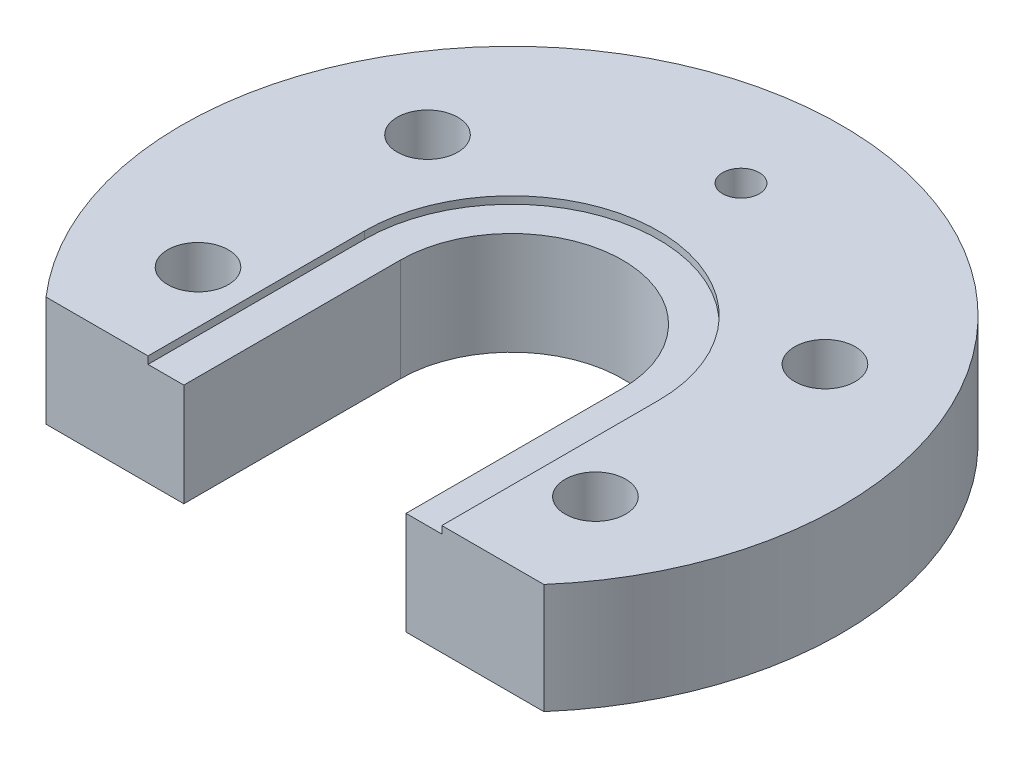
ISO-10303-21;
HEADER;
FILE_DESCRIPTION(('STEP AP214'),'2;1');
FILE_NAME('part.step','',(''),(''),'','','');
FILE_SCHEMA(('AUTOMOTIVE_DESIGN { 1 0 10303 214 1 1 1 1 }'));
ENDSEC;
DATA;
#1=APPLICATION_CONTEXT('core data for automotive mechanical design processes');
#2=APPLICATION_PROTOCOL_DEFINITION('international standard','automotive_design',2000,#1);
#3=PRODUCT_CONTEXT('',#1,'mechanical');
#4=PRODUCT('Part','Part','',(#3));
#5=PRODUCT_RELATED_PRODUCT_CATEGORY('part','',(#4));
#6=PRODUCT_DEFINITION_FORMATION('','',#4);
#7=PRODUCT_DEFINITION_CONTEXT('part definition',#1,'design');
#8=PRODUCT_DEFINITION('design','',#6,#7);
#9=PRODUCT_DEFINITION_SHAPE('','',#8);
#10=(LENGTH_UNIT() NAMED_UNIT(*) SI_UNIT(.MILLI.,.METRE.));
#11=(NAMED_UNIT(*) PLANE_ANGLE_UNIT() SI_UNIT($,.RADIAN.));
#12=(NAMED_UNIT(*) SI_UNIT($,.STERADIAN.) SOLID_ANGLE_UNIT());
#13=UNCERTAINTY_MEASURE_WITH_UNIT(LENGTH_MEASURE(1.E-05),#10,'distance_accuracy_value','');
#14=(GEOMETRIC_REPRESENTATION_CONTEXT(3) GLOBAL_UNCERTAINTY_ASSIGNED_CONTEXT((#13)) GLOBAL_UNIT_ASSIGNED_CONTEXT((#10,
#11,#12)) REPRESENTATION_CONTEXT('',''));
#15=CARTESIAN_POINT('',(0.,0.,0.));
#16=DIRECTION('',(0.,0.,1.));
#17=DIRECTION('',(1.,0.,0.));
#18=AXIS2_PLACEMENT_3D('',#15,#16,#17);
#19=CARTESIAN_POINT('',(-6.05,6.,0.));
#20=DIRECTION('',(-1.,0.,0.));
#21=DIRECTION('',(0.,0.,1.));
#22=AXIS2_PLACEMENT_3D('',#19,#20,#21);
#23=PLANE('',#22);
#24=DIRECTION('',(0.,0.,-1.));
#25=VECTOR('',#24,1.);
#26=CARTESIAN_POINT('',(-6.05,5.6,0.));
#27=LINE('',#26,#25);
#28=CARTESIAN_POINT('',(-6.05,5.6,11.79495));
#29=VERTEX_POINT('',#28);
#30=CARTESIAN_POINT('',(-6.05,5.6,0.));
#31=VERTEX_POINT('',#30);
#32=EDGE_CURVE('E179',#29,#31,#27,.T.);
#33=ORIENTED_EDGE('',*,*,#32,.F.);
#34=DIRECTION('',(0.,-1.,0.));
#35=VECTOR('',#34,1.);
#36=CARTESIAN_POINT('',(-6.05,6.,11.79495));
#37=LINE('',#36,#35);
#38=CARTESIAN_POINT('',(-6.05,0.,11.79495));
#39=VERTEX_POINT('',#38);
#40=EDGE_CURVE('E139',#29,#39,#37,.T.);
#41=ORIENTED_EDGE('',*,*,#40,.T.);
#42=DIRECTION('',(0.,0.,-1.));
#43=VECTOR('',#42,1.);
#44=CARTESIAN_POINT('',(-6.05,0.,0.));
#45=LINE('',#44,#43);
#46=CARTESIAN_POINT('',(-6.05,0.,0.));
#47=VERTEX_POINT('',#46);
#48=EDGE_CURVE('E120',#39,#47,#45,.T.);
#49=ORIENTED_EDGE('',*,*,#48,.T.);
#50=DIRECTION('',(0.,-1.,0.));
#51=VECTOR('',#50,1.);
#52=CARTESIAN_POINT('',(-6.05,6.,0.));
#53=LINE('',#52,#51);
#54=EDGE_CURVE('E137',#31,#47,#53,.T.);
#55=ORIENTED_EDGE('',*,*,#54,.F.);
#56=EDGE_LOOP('',(#33,#41,#49,#55));
#57=FACE_BOUND('',#56,.T.);
#58=ADVANCED_FACE('F45',(#57),#23,.F.);
#59=CARTESIAN_POINT('',(0.,6.,0.));
#60=DIRECTION('',(0.,-1.,0.));
#61=DIRECTION('',(0.,0.,-1.));
#62=AXIS2_PLACEMENT_3D('',#59,#60,#61);
#63=CYLINDRICAL_SURFACE('',#62,6.05);
#64=CARTESIAN_POINT('',(0.,5.6,0.));
#65=DIRECTION('',(0.,1.,0.));
#66=DIRECTION('',(0.,0.,1.));
#67=AXIS2_PLACEMENT_3D('',#64,#65,#66);
#68=CIRCLE('',#67,6.05);
#69=CARTESIAN_POINT('',(6.05,5.6,0.));
#70=VERTEX_POINT('',#69);
#71=EDGE_CURVE('E184',#31,#70,#68,.F.);
#72=ORIENTED_EDGE('',*,*,#71,.F.);
#73=ORIENTED_EDGE('',*,*,#54,.T.);
#74=CARTESIAN_POINT('',(0.,0.,0.));
#75=DIRECTION('',(0.,-1.,0.));
#76=DIRECTION('',(0.,0.,1.));
#77=AXIS2_PLACEMENT_3D('',#74,#75,#76);
#78=CIRCLE('',#77,6.05);
#79=CARTESIAN_POINT('',(6.05,0.,0.));
#80=VERTEX_POINT('',#79);
#81=EDGE_CURVE('E130',#47,#80,#78,.T.);
#82=ORIENTED_EDGE('',*,*,#81,.T.);
#83=DIRECTION('',(0.,-1.,0.));
#84=VECTOR('',#83,1.);
#85=CARTESIAN_POINT('',(6.05,6.,0.));
#86=LINE('',#85,#84);
#87=EDGE_CURVE('E135',#70,#80,#86,.T.);
#88=ORIENTED_EDGE('',*,*,#87,.F.);
#89=EDGE_LOOP('',(#72,#73,#82,#88));
#90=FACE_BOUND('',#89,.T.);
#91=ADVANCED_FACE('F251',(#90),#63,.F.);
#92=CARTESIAN_POINT('',(6.05,6.,0.));
#93=DIRECTION('',(1.,0.,0.));
#94=DIRECTION('',(0.,0.,-1.));
#95=AXIS2_PLACEMENT_3D('',#92,#93,#94);
#96=PLANE('',#95);
#97=DIRECTION('',(0.,0.,1.));
#98=VECTOR('',#97,1.);
#99=CARTESIAN_POINT('',(6.05,5.6,0.));
#100=LINE('',#99,#98);
#101=CARTESIAN_POINT('',(6.05,5.6,11.79495));
#102=VERTEX_POINT('',#101);
#103=EDGE_CURVE('E59',#70,#102,#100,.T.);
#104=ORIENTED_EDGE('',*,*,#103,.F.);
#105=ORIENTED_EDGE('',*,*,#87,.T.);
#106=DIRECTION('',(0.,0.,1.));
#107=VECTOR('',#106,1.);
#108=CARTESIAN_POINT('',(6.05,0.,0.));
#109=LINE('',#108,#107);
#110=CARTESIAN_POINT('',(6.05,0.,11.79495));
#111=VERTEX_POINT('',#110);
#112=EDGE_CURVE('E105',#80,#111,#109,.T.);
#113=ORIENTED_EDGE('',*,*,#112,.T.);
#114=DIRECTION('',(0.,-1.,0.));
#115=VECTOR('',#114,1.);
#116=CARTESIAN_POINT('',(6.05,6.,11.79495));
#117=LINE('',#116,#115);
#118=EDGE_CURVE('E99',#102,#111,#117,.T.);
#119=ORIENTED_EDGE('',*,*,#118,.F.);
#120=EDGE_LOOP('',(#104,#105,#113,#119));
#121=FACE_BOUND('',#120,.T.);
#122=ADVANCED_FACE('F254',(#121),#96,.F.);
#123=CARTESIAN_POINT('',(0.,6.,0.));
#124=DIRECTION('',(0.,1.,0.));
#125=DIRECTION('',(0.,0.,1.));
#126=AXIS2_PLACEMENT_3D('',#123,#124,#125);
#127=PLANE('',#126);
#128=DIRECTION('',(0.,0.,-1.));
#129=VECTOR('',#128,1.);
#130=CARTESIAN_POINT('',(8.,6.,11.79495));
#131=LINE('',#130,#129);
#132=CARTESIAN_POINT('',(8.,6.,11.79495));
#133=VERTEX_POINT('',#132);
#134=CARTESIAN_POINT('',(8.,6.,0.));
#135=VERTEX_POINT('',#134);
#136=EDGE_CURVE('E198',#133,#135,#131,.T.);
#137=ORIENTED_EDGE('',*,*,#136,.F.);
#138=DIRECTION('',(1.,0.,0.));
#139=VECTOR('',#138,1.);
#140=CARTESIAN_POINT('',(13.556161190396,6.,11.79495));
#141=LINE('',#140,#139);
#142=CARTESIAN_POINT('',(13.556161190396,6.,11.79495));
#143=VERTEX_POINT('',#142);
#144=EDGE_CURVE('E68',#133,#143,#141,.T.);
#145=ORIENTED_EDGE('',*,*,#144,.T.);
#146=CARTESIAN_POINT('',(0.,6.,0.));
#147=DIRECTION('',(0.,1.,0.));
#148=DIRECTION('',(0.,0.,1.));
#149=AXIS2_PLACEMENT_3D('',#146,#147,#148);
#150=CIRCLE('',#149,17.96915);
#151=CARTESIAN_POINT('',(-13.556161190396,6.,11.79495));
#152=VERTEX_POINT('',#151);
#153=EDGE_CURVE('E104',#143,#152,#150,.T.);
#154=ORIENTED_EDGE('',*,*,#153,.T.);
#155=DIRECTION('',(1.,0.,0.));
#156=VECTOR('',#155,1.);
#157=CARTESIAN_POINT('',(-6.05,6.,11.79495));
#158=LINE('',#157,#156);
#159=CARTESIAN_POINT('',(-8.,6.,11.79495));
#160=VERTEX_POINT('',#159);
#161=EDGE_CURVE('E146',#152,#160,#158,.T.);
#162=ORIENTED_EDGE('',*,*,#161,.T.);
#163=DIRECTION('',(0.,0.,1.));
#164=VECTOR('',#163,1.);
#165=CARTESIAN_POINT('',(-8.,6.,0.));
#166=LINE('',#165,#164);
#167=CARTESIAN_POINT('',(-8.,6.,0.));
#168=VERTEX_POINT('',#167);
#169=EDGE_CURVE('E202',#168,#160,#166,.T.);
#170=ORIENTED_EDGE('',*,*,#169,.F.);
#171=CARTESIAN_POINT('',(0.,6.,0.));
#172=DIRECTION('',(0.,1.,0.));
#173=DIRECTION('',(0.,0.,1.));
#174=AXIS2_PLACEMENT_3D('',#171,#172,#173);
#175=CIRCLE('',#174,8.);
#176=EDGE_CURVE('E205',#135,#168,#175,.T.);
#177=ORIENTED_EDGE('',*,*,#176,.F.);
#178=EDGE_LOOP('',(#137,#145,#154,#162,#170,#177));
#179=FACE_BOUND('',#178,.T.);
#180=CARTESIAN_POINT('',(-10.82295,6.,6.24955));
#181=DIRECTION('',(0.,1.,0.));
#182=DIRECTION('',(0.,0.,1.));
#183=AXIS2_PLACEMENT_3D('',#180,#181,#182);
#184=CIRCLE('',#183,1.65);
#185=CARTESIAN_POINT('',(-10.82295,6.,7.89955));
#186=VERTEX_POINT('',#185);
#187=EDGE_CURVE('E167',#186,#186,#184,.T.);
#188=ORIENTED_EDGE('',*,*,#187,.F.);
#189=EDGE_LOOP('',(#188));
#190=FACE_BOUND('',#189,.T.);
#191=CARTESIAN_POINT('',(10.82295,6.,-6.24955));
#192=DIRECTION('',(0.,1.,0.));
#193=DIRECTION('',(0.,0.,1.));
#194=AXIS2_PLACEMENT_3D('',#191,#192,#193);
#195=CIRCLE('',#194,1.65);
#196=CARTESIAN_POINT('',(10.82295,6.,-4.59955));
#197=VERTEX_POINT('',#196);
#198=EDGE_CURVE('E156',#197,#197,#195,.T.);
#199=ORIENTED_EDGE('',*,*,#198,.F.);
#200=EDGE_LOOP('',(#199));
#201=FACE_BOUND('',#200,.T.);
#202=CARTESIAN_POINT('',(-10.82295,6.,-6.24955));
#203=DIRECTION('',(0.,1.,0.));
#204=DIRECTION('',(0.,0.,1.));
#205=AXIS2_PLACEMENT_3D('',#202,#203,#204);
#206=CIRCLE('',#205,1.65);
#207=CARTESIAN_POINT('',(-10.82295,6.,-4.59955));
#208=VERTEX_POINT('',#207);
#209=EDGE_CURVE('E118',#208,#208,#206,.T.);
#210=ORIENTED_EDGE('',*,*,#209,.F.);
#211=EDGE_LOOP('',(#210));
#212=FACE_BOUND('',#211,.T.);
#213=CARTESIAN_POINT('',(10.82295,6.,6.24955));
#214=DIRECTION('',(0.,1.,0.));
#215=DIRECTION('',(0.,0.,1.));
#216=AXIS2_PLACEMENT_3D('',#213,#214,#215);
#217=CIRCLE('',#216,1.65);
#218=CARTESIAN_POINT('',(10.82295,6.,7.89955));
#219=VERTEX_POINT('',#218);
#220=EDGE_CURVE('E161',#219,#219,#217,.T.);
#221=ORIENTED_EDGE('',*,*,#220,.F.);
#222=EDGE_LOOP('',(#221));
#223=FACE_BOUND('',#222,.T.);
#224=CARTESIAN_POINT('',(0.,6.,-12.4985));
#225=DIRECTION('',(0.,1.,0.));
#226=DIRECTION('',(0.,0.,1.));
#227=AXIS2_PLACEMENT_3D('',#224,#225,#226);
#228=CIRCLE('',#227,1.);
#229=CARTESIAN_POINT('',(0.,6.,-11.4985));
#230=VERTEX_POINT('',#229);
#231=EDGE_CURVE('E173',#230,#230,#228,.T.);
#232=ORIENTED_EDGE('',*,*,#231,.F.);
#233=EDGE_LOOP('',(#232));
#234=FACE_BOUND('',#233,.T.);
#235=ADVANCED_FACE('F151',(#179,#190,#201,#212,#223,#234),#127,.T.);
#236=CARTESIAN_POINT('',(0.,0.,0.));
#237=DIRECTION('',(0.,1.,0.));
#238=DIRECTION('',(0.,0.,1.));
#239=AXIS2_PLACEMENT_3D('',#236,#237,#238);
#240=PLANE('',#239);
#241=CARTESIAN_POINT('',(0.,0.,0.));
#242=DIRECTION('',(0.,1.,0.));
#243=DIRECTION('',(0.,0.,1.));
#244=AXIS2_PLACEMENT_3D('',#241,#242,#243);
#245=CIRCLE('',#244,17.96915);
#246=CARTESIAN_POINT('',(13.556161190396,0.,11.79495));
#247=VERTEX_POINT('',#246);
#248=CARTESIAN_POINT('',(-13.556161190396,0.,11.79495));
#249=VERTEX_POINT('',#248);
#250=EDGE_CURVE('E110',#247,#249,#245,.T.);
#251=ORIENTED_EDGE('',*,*,#250,.F.);
#252=DIRECTION('',(1.,0.,0.));
#253=VECTOR('',#252,1.);
#254=CARTESIAN_POINT('',(13.556161190396,0.,11.79495));
#255=LINE('',#254,#253);
#256=EDGE_CURVE('E93',#111,#247,#255,.T.);
#257=ORIENTED_EDGE('',*,*,#256,.F.);
#258=ORIENTED_EDGE('',*,*,#112,.F.);
#259=ORIENTED_EDGE('',*,*,#81,.F.);
#260=ORIENTED_EDGE('',*,*,#48,.F.);
#261=DIRECTION('',(1.,0.,0.));
#262=VECTOR('',#261,1.);
#263=CARTESIAN_POINT('',(-6.05,0.,11.79495));
#264=LINE('',#263,#262);
#265=EDGE_CURVE('E116',#249,#39,#264,.T.);
#266=ORIENTED_EDGE('',*,*,#265,.F.);
#267=EDGE_LOOP('',(#251,#257,#258,#259,#260,#266));
#268=FACE_BOUND('',#267,.T.);
#269=CARTESIAN_POINT('',(-10.82295,0.,-6.24955));
#270=DIRECTION('',(0.,1.,0.));
#271=DIRECTION('',(0.,0.,1.));
#272=AXIS2_PLACEMENT_3D('',#269,#270,#271);
#273=CIRCLE('',#272,1.65);
#274=CARTESIAN_POINT('',(-10.82295,0.,-4.59955));
#275=VERTEX_POINT('',#274);
#276=EDGE_CURVE('E123',#275,#275,#273,.T.);
#277=ORIENTED_EDGE('',*,*,#276,.T.);
#278=EDGE_LOOP('',(#277));
#279=FACE_BOUND('',#278,.T.);
#280=CARTESIAN_POINT('',(10.82295,0.,-6.24955));
#281=DIRECTION('',(0.,1.,0.));
#282=DIRECTION('',(0.,0.,1.));
#283=AXIS2_PLACEMENT_3D('',#280,#281,#282);
#284=CIRCLE('',#283,1.65);
#285=CARTESIAN_POINT('',(10.82295,0.,-4.59955));
#286=VERTEX_POINT('',#285);
#287=EDGE_CURVE('E158',#286,#286,#284,.T.);
#288=ORIENTED_EDGE('',*,*,#287,.T.);
#289=EDGE_LOOP('',(#288));
#290=FACE_BOUND('',#289,.T.);
#291=CARTESIAN_POINT('',(10.82295,0.,6.24955));
#292=DIRECTION('',(0.,1.,0.));
#293=DIRECTION('',(0.,0.,1.));
#294=AXIS2_PLACEMENT_3D('',#291,#292,#293);
#295=CIRCLE('',#294,1.65);
#296=CARTESIAN_POINT('',(10.82295,0.,7.89955));
#297=VERTEX_POINT('',#296);
#298=EDGE_CURVE('E164',#297,#297,#295,.T.);
#299=ORIENTED_EDGE('',*,*,#298,.T.);
#300=EDGE_LOOP('',(#299));
#301=FACE_BOUND('',#300,.T.);
#302=CARTESIAN_POINT('',(-10.82295,0.,6.24955));
#303=DIRECTION('',(0.,1.,0.));
#304=DIRECTION('',(0.,0.,1.));
#305=AXIS2_PLACEMENT_3D('',#302,#303,#304);
#306=CIRCLE('',#305,1.65);
#307=CARTESIAN_POINT('',(-10.82295,0.,7.89955));
#308=VERTEX_POINT('',#307);
#309=EDGE_CURVE('E170',#308,#308,#306,.T.);
#310=ORIENTED_EDGE('',*,*,#309,.T.);
#311=EDGE_LOOP('',(#310));
#312=FACE_BOUND('',#311,.T.);
#313=CARTESIAN_POINT('',(0.,0.,-12.4985));
#314=DIRECTION('',(0.,1.,0.));
#315=DIRECTION('',(0.,0.,1.));
#316=AXIS2_PLACEMENT_3D('',#313,#314,#315);
#317=CIRCLE('',#316,1.);
#318=CARTESIAN_POINT('',(0.,0.,-11.4985));
#319=VERTEX_POINT('',#318);
#320=EDGE_CURVE('E176',#319,#319,#317,.T.);
#321=ORIENTED_EDGE('',*,*,#320,.T.);
#322=EDGE_LOOP('',(#321));
#323=FACE_BOUND('',#322,.T.);
#324=ADVANCED_FACE('F112',(#268,#279,#290,#301,#312,#323),#240,.F.);
#325=CARTESIAN_POINT('',(0.,6.,0.));
#326=DIRECTION('',(0.,-1.,0.));
#327=DIRECTION('',(0.,0.,-1.));
#328=AXIS2_PLACEMENT_3D('',#325,#326,#327);
#329=CYLINDRICAL_SURFACE('',#328,17.96915);
#330=ORIENTED_EDGE('',*,*,#250,.T.);
#331=DIRECTION('',(0.,-1.,0.));
#332=VECTOR('',#331,1.);
#333=CARTESIAN_POINT('',(-13.556161190396,6.,11.79495));
#334=LINE('',#333,#332);
#335=EDGE_CURVE('E53',#152,#249,#334,.T.);
#336=ORIENTED_EDGE('',*,*,#335,.F.);
#337=ORIENTED_EDGE('',*,*,#153,.F.);
#338=DIRECTION('',(0.,-1.,0.));
#339=VECTOR('',#338,1.);
#340=CARTESIAN_POINT('',(13.556161190396,6.,11.79495));
#341=LINE('',#340,#339);
#342=EDGE_CURVE('E96',#143,#247,#341,.T.);
#343=ORIENTED_EDGE('',*,*,#342,.T.);
#344=EDGE_LOOP('',(#330,#336,#337,#343));
#345=FACE_BOUND('',#344,.T.);
#346=ADVANCED_FACE('F47',(#345),#329,.T.);
#347=CARTESIAN_POINT('',(-6.05,6.,11.79495));
#348=DIRECTION('',(0.,0.,-1.));
#349=DIRECTION('',(-1.,0.,0.));
#350=AXIS2_PLACEMENT_3D('',#347,#348,#349);
#351=PLANE('',#350);
#352=DIRECTION('',(1.,0.,0.));
#353=VECTOR('',#352,1.);
#354=CARTESIAN_POINT('',(-8.,5.6,11.79495));
#355=LINE('',#354,#353);
#356=CARTESIAN_POINT('',(-8.,5.6,11.79495));
#357=VERTEX_POINT('',#356);
#358=EDGE_CURVE('E210',#357,#29,#355,.T.);
#359=ORIENTED_EDGE('',*,*,#358,.F.);
#360=DIRECTION('',(0.,1.,0.));
#361=VECTOR('',#360,1.);
#362=CARTESIAN_POINT('',(-8.,5.6,11.79495));
#363=LINE('',#362,#361);
#364=EDGE_CURVE('E149',#357,#160,#363,.T.);
#365=ORIENTED_EDGE('',*,*,#364,.T.);
#366=ORIENTED_EDGE('',*,*,#161,.F.);
#367=ORIENTED_EDGE('',*,*,#335,.T.);
#368=ORIENTED_EDGE('',*,*,#265,.T.);
#369=ORIENTED_EDGE('',*,*,#40,.F.);
#370=EDGE_LOOP('',(#359,#365,#366,#367,#368,#369));
#371=FACE_BOUND('',#370,.T.);
#372=ADVANCED_FACE('F142',(#371),#351,.F.);
#373=CARTESIAN_POINT('',(13.556161190396,6.,11.79495));
#374=DIRECTION('',(0.,0.,-1.));
#375=DIRECTION('',(-1.,0.,0.));
#376=AXIS2_PLACEMENT_3D('',#373,#374,#375);
#377=PLANE('',#376);
#378=ORIENTED_EDGE('',*,*,#144,.F.);
#379=DIRECTION('',(0.,1.,0.));
#380=VECTOR('',#379,1.);
#381=CARTESIAN_POINT('',(8.,5.6,11.79495));
#382=LINE('',#381,#380);
#383=CARTESIAN_POINT('',(8.,5.6,11.79495));
#384=VERTEX_POINT('',#383);
#385=EDGE_CURVE('E193',#384,#133,#382,.T.);
#386=ORIENTED_EDGE('',*,*,#385,.F.);
#387=DIRECTION('',(1.,0.,0.));
#388=VECTOR('',#387,1.);
#389=CARTESIAN_POINT('',(13.556161190396,5.6,11.79495));
#390=LINE('',#389,#388);
#391=EDGE_CURVE('E13',#102,#384,#390,.T.);
#392=ORIENTED_EDGE('',*,*,#391,.F.);
#393=ORIENTED_EDGE('',*,*,#118,.T.);
#394=ORIENTED_EDGE('',*,*,#256,.T.);
#395=ORIENTED_EDGE('',*,*,#342,.F.);
#396=EDGE_LOOP('',(#378,#386,#392,#393,#394,#395));
#397=FACE_BOUND('',#396,.T.);
#398=ADVANCED_FACE('F95',(#397),#377,.F.);
#399=CARTESIAN_POINT('',(-10.82295,6.,-6.24955));
#400=DIRECTION('',(0.,-1.,0.));
#401=DIRECTION('',(0.,0.,-1.));
#402=AXIS2_PLACEMENT_3D('',#399,#400,#401);
#403=CYLINDRICAL_SURFACE('',#402,1.65);
#404=ORIENTED_EDGE('',*,*,#209,.T.);
#405=EDGE_LOOP('',(#404));
#406=FACE_BOUND('',#405,.T.);
#407=ORIENTED_EDGE('',*,*,#276,.F.);
#408=EDGE_LOOP('',(#407));
#409=FACE_BOUND('',#408,.T.);
#410=ADVANCED_FACE('F273',(#406,#409),#403,.F.);
#411=CARTESIAN_POINT('',(10.82295,6.,-6.24955));
#412=DIRECTION('',(0.,-1.,0.));
#413=DIRECTION('',(0.,0.,-1.));
#414=AXIS2_PLACEMENT_3D('',#411,#412,#413);
#415=CYLINDRICAL_SURFACE('',#414,1.65);
#416=ORIENTED_EDGE('',*,*,#198,.T.);
#417=EDGE_LOOP('',(#416));
#418=FACE_BOUND('',#417,.T.);
#419=ORIENTED_EDGE('',*,*,#287,.F.);
#420=EDGE_LOOP('',(#419));
#421=FACE_BOUND('',#420,.T.);
#422=ADVANCED_FACE('F283',(#418,#421),#415,.F.);
#423=CARTESIAN_POINT('',(10.82295,6.,6.24955));
#424=DIRECTION('',(0.,-1.,0.));
#425=DIRECTION('',(0.,0.,-1.));
#426=AXIS2_PLACEMENT_3D('',#423,#424,#425);
#427=CYLINDRICAL_SURFACE('',#426,1.65);
#428=ORIENTED_EDGE('',*,*,#220,.T.);
#429=EDGE_LOOP('',(#428));
#430=FACE_BOUND('',#429,.T.);
#431=ORIENTED_EDGE('',*,*,#298,.F.);
#432=EDGE_LOOP('',(#431));
#433=FACE_BOUND('',#432,.T.);
#434=ADVANCED_FACE('F287',(#430,#433),#427,.F.);
#435=CARTESIAN_POINT('',(-10.82295,6.,6.24955));
#436=DIRECTION('',(0.,-1.,0.));
#437=DIRECTION('',(0.,0.,-1.));
#438=AXIS2_PLACEMENT_3D('',#435,#436,#437);
#439=CYLINDRICAL_SURFACE('',#438,1.65);
#440=ORIENTED_EDGE('',*,*,#187,.T.);
#441=EDGE_LOOP('',(#440));
#442=FACE_BOUND('',#441,.T.);
#443=ORIENTED_EDGE('',*,*,#309,.F.);
#444=EDGE_LOOP('',(#443));
#445=FACE_BOUND('',#444,.T.);
#446=ADVANCED_FACE('F291',(#442,#445),#439,.F.);
#447=CARTESIAN_POINT('',(0.,6.,-12.4985));
#448=DIRECTION('',(0.,-1.,0.));
#449=DIRECTION('',(0.,0.,-1.));
#450=AXIS2_PLACEMENT_3D('',#447,#448,#449);
#451=CYLINDRICAL_SURFACE('',#450,1.);
#452=ORIENTED_EDGE('',*,*,#231,.T.);
#453=EDGE_LOOP('',(#452));
#454=FACE_BOUND('',#453,.T.);
#455=ORIENTED_EDGE('',*,*,#320,.F.);
#456=EDGE_LOOP('',(#455));
#457=FACE_BOUND('',#456,.T.);
#458=ADVANCED_FACE('F295',(#454,#457),#451,.F.);
#459=CARTESIAN_POINT('',(0.,5.6,0.));
#460=DIRECTION('',(0.,1.,0.));
#461=DIRECTION('',(0.,0.,1.));
#462=AXIS2_PLACEMENT_3D('',#459,#460,#461);
#463=PLANE('',#462);
#464=ORIENTED_EDGE('',*,*,#32,.T.);
#465=ORIENTED_EDGE('',*,*,#71,.T.);
#466=ORIENTED_EDGE('',*,*,#103,.T.);
#467=ORIENTED_EDGE('',*,*,#391,.T.);
#468=DIRECTION('',(0.,0.,-1.));
#469=VECTOR('',#468,1.);
#470=CARTESIAN_POINT('',(8.,5.6,11.79495));
#471=LINE('',#470,#469);
#472=CARTESIAN_POINT('',(8.,5.6,0.));
#473=VERTEX_POINT('',#472);
#474=EDGE_CURVE('E191',#384,#473,#471,.T.);
#475=ORIENTED_EDGE('',*,*,#474,.T.);
#476=CARTESIAN_POINT('',(0.,5.6,0.));
#477=DIRECTION('',(0.,1.,0.));
#478=DIRECTION('',(0.,0.,1.));
#479=AXIS2_PLACEMENT_3D('',#476,#477,#478);
#480=CIRCLE('',#479,8.);
#481=CARTESIAN_POINT('',(-8.,5.6,0.));
#482=VERTEX_POINT('',#481);
#483=EDGE_CURVE('E201',#473,#482,#480,.T.);
#484=ORIENTED_EDGE('',*,*,#483,.T.);
#485=DIRECTION('',(0.,0.,1.));
#486=VECTOR('',#485,1.);
#487=CARTESIAN_POINT('',(-8.,5.6,0.));
#488=LINE('',#487,#486);
#489=EDGE_CURVE('E213',#482,#357,#488,.T.);
#490=ORIENTED_EDGE('',*,*,#489,.T.);
#491=ORIENTED_EDGE('',*,*,#358,.T.);
#492=EDGE_LOOP('',(#464,#465,#466,#467,#475,#484,#490,#491));
#493=FACE_BOUND('',#492,.T.);
#494=ADVANCED_FACE('F219',(#493),#463,.T.);
#495=CARTESIAN_POINT('',(0.,5.6,0.));
#496=DIRECTION('',(0.,1.,0.));
#497=DIRECTION('',(0.,0.,1.));
#498=AXIS2_PLACEMENT_3D('',#495,#496,#497);
#499=CYLINDRICAL_SURFACE('',#498,8.);
#500=ORIENTED_EDGE('',*,*,#176,.T.);
#501=DIRECTION('',(0.,1.,0.));
#502=VECTOR('',#501,1.);
#503=CARTESIAN_POINT('',(-8.,5.6,0.));
#504=LINE('',#503,#502);
#505=EDGE_CURVE('E188',#482,#168,#504,.T.);
#506=ORIENTED_EDGE('',*,*,#505,.F.);
#507=ORIENTED_EDGE('',*,*,#483,.F.);
#508=DIRECTION('',(0.,1.,0.));
#509=VECTOR('',#508,1.);
#510=CARTESIAN_POINT('',(8.,5.6,0.));
#511=LINE('',#510,#509);
#512=EDGE_CURVE('E187',#473,#135,#511,.T.);
#513=ORIENTED_EDGE('',*,*,#512,.T.);
#514=EDGE_LOOP('',(#500,#506,#507,#513));
#515=FACE_BOUND('',#514,.T.);
#516=ADVANCED_FACE('F228',(#515),#499,.F.);
#517=CARTESIAN_POINT('',(8.,5.6,11.79495));
#518=DIRECTION('',(1.,0.,0.));
#519=DIRECTION('',(0.,0.,-1.));
#520=AXIS2_PLACEMENT_3D('',#517,#518,#519);
#521=PLANE('',#520);
#522=ORIENTED_EDGE('',*,*,#136,.T.);
#523=ORIENTED_EDGE('',*,*,#512,.F.);
#524=ORIENTED_EDGE('',*,*,#474,.F.);
#525=ORIENTED_EDGE('',*,*,#385,.T.);
#526=EDGE_LOOP('',(#522,#523,#524,#525));
#527=FACE_BOUND('',#526,.T.);
#528=ADVANCED_FACE('F302',(#527),#521,.F.);
#529=CARTESIAN_POINT('',(-8.,5.6,0.));
#530=DIRECTION('',(-1.,0.,0.));
#531=DIRECTION('',(0.,0.,1.));
#532=AXIS2_PLACEMENT_3D('',#529,#530,#531);
#533=PLANE('',#532);
#534=ORIENTED_EDGE('',*,*,#169,.T.);
#535=ORIENTED_EDGE('',*,*,#364,.F.);
#536=ORIENTED_EDGE('',*,*,#489,.F.);
#537=ORIENTED_EDGE('',*,*,#505,.T.);
#538=EDGE_LOOP('',(#534,#535,#536,#537));
#539=FACE_BOUND('',#538,.T.);
#540=ADVANCED_FACE('F303',(#539),#533,.F.);
#541=CLOSED_SHELL('',(#58,#91,#122,#235,#324,#346,#372,#398,#410,#422,#434,#446,#458,#494,#516,
#528,#540));
#542=MANIFOLD_SOLID_BREP('B2',#541);
#543=ADVANCED_BREP_SHAPE_REPRESENTATION('',(#18,#542),#14);
#544=SHAPE_DEFINITION_REPRESENTATION(#9,#543);
ENDSEC;
END-ISO-10303-21;
